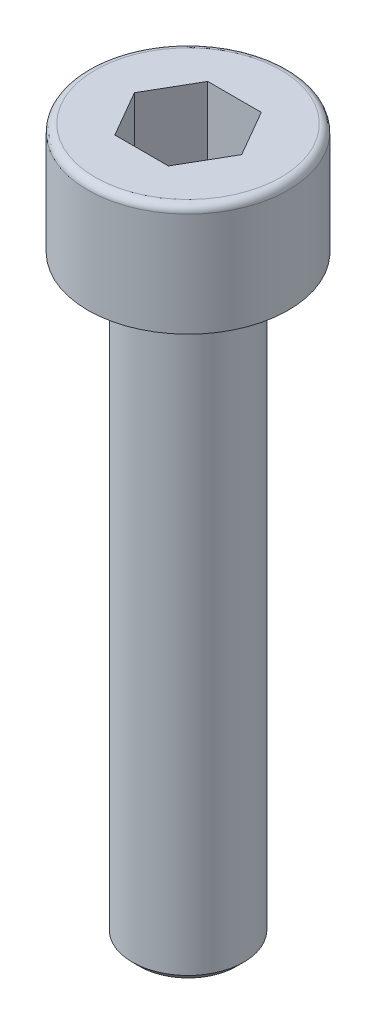
ISO-10303-21;
HEADER;
FILE_DESCRIPTION(('STEP AP214'),'2;1');
FILE_NAME('part.step','',(''),(''),'','','');
FILE_SCHEMA(('AUTOMOTIVE_DESIGN { 1 0 10303 214 1 1 1 1 }'));
ENDSEC;
DATA;
#1=APPLICATION_CONTEXT('core data for automotive mechanical design processes');
#2=APPLICATION_PROTOCOL_DEFINITION('international standard','automotive_design',2000,#1);
#3=PRODUCT_CONTEXT('',#1,'mechanical');
#4=PRODUCT('Part','Part','',(#3));
#5=PRODUCT_RELATED_PRODUCT_CATEGORY('part','',(#4));
#6=PRODUCT_DEFINITION_FORMATION('','',#4);
#7=PRODUCT_DEFINITION_CONTEXT('part definition',#1,'design');
#8=PRODUCT_DEFINITION('design','',#6,#7);
#9=PRODUCT_DEFINITION_SHAPE('','',#8);
#10=(LENGTH_UNIT() NAMED_UNIT(*) SI_UNIT(.MILLI.,.METRE.));
#11=(NAMED_UNIT(*) PLANE_ANGLE_UNIT() SI_UNIT($,.RADIAN.));
#12=(NAMED_UNIT(*) SI_UNIT($,.STERADIAN.) SOLID_ANGLE_UNIT());
#13=UNCERTAINTY_MEASURE_WITH_UNIT(LENGTH_MEASURE(1.E-05),#10,'distance_accuracy_value','');
#14=(GEOMETRIC_REPRESENTATION_CONTEXT(3) GLOBAL_UNCERTAINTY_ASSIGNED_CONTEXT((#13)) GLOBAL_UNIT_ASSIGNED_CONTEXT((#10,
#11,#12)) REPRESENTATION_CONTEXT('',''));
#15=CARTESIAN_POINT('',(0.,0.,0.));
#16=DIRECTION('',(0.,0.,1.));
#17=DIRECTION('',(1.,0.,0.));
#18=AXIS2_PLACEMENT_3D('',#15,#16,#17);
#19=CARTESIAN_POINT('',(0.,3.,-2.5));
#20=DIRECTION('',(0.,-1.,0.));
#21=DIRECTION('',(0.,0.,-1.));
#22=AXIS2_PLACEMENT_3D('',#19,#20,#21);
#23=PLANE('',#22);
#24=DIRECTION('',(-1.,0.,0.));
#25=VECTOR('',#24,1.);
#26=CARTESIAN_POINT('',(0.721687836487032,3.,-1.25));
#27=LINE('',#26,#25);
#28=CARTESIAN_POINT('',(0.721687836487032,3.,-1.25));
#29=VERTEX_POINT('',#28);
#30=CARTESIAN_POINT('',(-0.721687836487032,3.,-1.25));
#31=VERTEX_POINT('',#30);
#32=EDGE_CURVE('E122',#29,#31,#27,.T.);
#33=ORIENTED_EDGE('',*,*,#32,.F.);
#34=DIRECTION('',(-0.5,0.,-0.866025403784439));
#35=VECTOR('',#34,1.);
#36=CARTESIAN_POINT('',(1.44337567297406,3.,0.));
#37=LINE('',#36,#35);
#38=CARTESIAN_POINT('',(1.44337567297406,3.,0.));
#39=VERTEX_POINT('',#38);
#40=EDGE_CURVE('E48',#39,#29,#37,.T.);
#41=ORIENTED_EDGE('',*,*,#40,.F.);
#42=DIRECTION('',(0.5,0.,-0.866025403784438));
#43=VECTOR('',#42,1.);
#44=CARTESIAN_POINT('',(0.721687836487032,3.,1.25));
#45=LINE('',#44,#43);
#46=CARTESIAN_POINT('',(0.721687836487032,3.,1.25));
#47=VERTEX_POINT('',#46);
#48=EDGE_CURVE('E131',#47,#39,#45,.T.);
#49=ORIENTED_EDGE('',*,*,#48,.F.);
#50=DIRECTION('',(1.,0.,0.));
#51=VECTOR('',#50,1.);
#52=CARTESIAN_POINT('',(-0.721687836487032,3.,1.25));
#53=LINE('',#52,#51);
#54=CARTESIAN_POINT('',(-0.721687836487032,3.,1.25));
#55=VERTEX_POINT('',#54);
#56=EDGE_CURVE('E129',#55,#47,#53,.T.);
#57=ORIENTED_EDGE('',*,*,#56,.F.);
#58=DIRECTION('',(0.5,0.,0.866025403784439));
#59=VECTOR('',#58,1.);
#60=CARTESIAN_POINT('',(-1.44337567297406,3.,0.));
#61=LINE('',#60,#59);
#62=CARTESIAN_POINT('',(-1.44337567297406,3.,0.));
#63=VERTEX_POINT('',#62);
#64=EDGE_CURVE('E96',#63,#55,#61,.T.);
#65=ORIENTED_EDGE('',*,*,#64,.F.);
#66=DIRECTION('',(-0.5,0.,0.866025403784439));
#67=VECTOR('',#66,1.);
#68=CARTESIAN_POINT('',(-0.721687836487032,3.,-1.25));
#69=LINE('',#68,#67);
#70=EDGE_CURVE('E125',#31,#63,#69,.T.);
#71=ORIENTED_EDGE('',*,*,#70,.F.);
#72=EDGE_LOOP('',(#33,#41,#49,#57,#65,#71));
#73=FACE_BOUND('',#72,.T.);
#74=CARTESIAN_POINT('',(0.,3.,0.));
#75=DIRECTION('',(0.,1.,0.));
#76=DIRECTION('',(0.,0.,1.));
#77=AXIS2_PLACEMENT_3D('',#74,#75,#76);
#78=CIRCLE('',#77,2.5);
#79=CARTESIAN_POINT('',(0.,3.,2.5));
#80=VERTEX_POINT('',#79);
#81=EDGE_CURVE('E11',#80,#80,#78,.T.);
#82=ORIENTED_EDGE('',*,*,#81,.T.);
#83=EDGE_LOOP('',(#82));
#84=FACE_BOUND('',#83,.T.);
#85=ADVANCED_FACE('F34',(#73,#84),#23,.F.);
#86=CARTESIAN_POINT('',(0.,2.8,0.));
#87=DIRECTION('',(0.,1.,0.));
#88=DIRECTION('',(0.,0.,1.));
#89=AXIS2_PLACEMENT_3D('',#86,#87,#88);
#90=TOROIDAL_SURFACE('',#89,2.5,0.2);
#91=ORIENTED_EDGE('',*,*,#81,.F.);
#92=EDGE_LOOP('',(#91));
#93=FACE_BOUND('',#92,.T.);
#94=CARTESIAN_POINT('',(0.,2.8,0.));
#95=DIRECTION('',(0.,1.,0.));
#96=DIRECTION('',(0.,0.,1.));
#97=AXIS2_PLACEMENT_3D('',#94,#95,#96);
#98=CIRCLE('',#97,2.7);
#99=CARTESIAN_POINT('',(0.,2.8,2.7));
#100=VERTEX_POINT('',#99);
#101=EDGE_CURVE('E41',#100,#100,#98,.T.);
#102=ORIENTED_EDGE('',*,*,#101,.T.);
#103=EDGE_LOOP('',(#102));
#104=FACE_BOUND('',#103,.T.);
#105=ADVANCED_FACE('F157',(#93,#104),#90,.T.);
#106=CARTESIAN_POINT('',(0.,11.8274509803922,0.));
#107=DIRECTION('',(0.,1.,0.));
#108=DIRECTION('',(0.,0.,1.));
#109=AXIS2_PLACEMENT_3D('',#106,#107,#108);
#110=CYLINDRICAL_SURFACE('',#109,2.7);
#111=ORIENTED_EDGE('',*,*,#101,.F.);
#112=EDGE_LOOP('',(#111));
#113=FACE_BOUND('',#112,.T.);
#114=CARTESIAN_POINT('',(0.,0.,0.));
#115=DIRECTION('',(0.,1.,0.));
#116=DIRECTION('',(0.,0.,1.));
#117=AXIS2_PLACEMENT_3D('',#114,#115,#116);
#118=CIRCLE('',#117,2.7);
#119=CARTESIAN_POINT('',(0.,0.,2.7));
#120=VERTEX_POINT('',#119);
#121=EDGE_CURVE('E152',#120,#120,#118,.T.);
#122=ORIENTED_EDGE('',*,*,#121,.T.);
#123=EDGE_LOOP('',(#122));
#124=FACE_BOUND('',#123,.T.);
#125=ADVANCED_FACE('F159',(#113,#124),#110,.T.);
#126=CARTESIAN_POINT('',(0.,0.,-1.7));
#127=DIRECTION('',(0.,1.,0.));
#128=DIRECTION('',(0.,0.,1.));
#129=AXIS2_PLACEMENT_3D('',#126,#127,#128);
#130=PLANE('',#129);
#131=ORIENTED_EDGE('',*,*,#121,.F.);
#132=EDGE_LOOP('',(#131));
#133=FACE_BOUND('',#132,.T.);
#134=CARTESIAN_POINT('',(0.,0.,0.));
#135=DIRECTION('',(0.,1.,0.));
#136=DIRECTION('',(0.,0.,1.));
#137=AXIS2_PLACEMENT_3D('',#134,#135,#136);
#138=CIRCLE('',#137,1.7);
#139=CARTESIAN_POINT('',(0.,0.,1.7));
#140=VERTEX_POINT('',#139);
#141=EDGE_CURVE('E149',#140,#140,#138,.T.);
#142=ORIENTED_EDGE('',*,*,#141,.T.);
#143=EDGE_LOOP('',(#142));
#144=FACE_BOUND('',#143,.T.);
#145=ADVANCED_FACE('F162',(#133,#144),#130,.F.);
#146=CARTESIAN_POINT('',(0.,-0.2,0.));
#147=DIRECTION('',(0.,1.,0.));
#148=DIRECTION('',(0.,0.,1.));
#149=AXIS2_PLACEMENT_3D('',#146,#147,#148);
#150=TOROIDAL_SURFACE('',#149,1.7,0.2);
#151=ORIENTED_EDGE('',*,*,#141,.F.);
#152=EDGE_LOOP('',(#151));
#153=FACE_BOUND('',#152,.T.);
#154=CARTESIAN_POINT('',(0.,-0.199999999999999,0.));
#155=DIRECTION('',(0.,1.,0.));
#156=DIRECTION('',(0.,0.,1.));
#157=AXIS2_PLACEMENT_3D('',#154,#155,#156);
#158=CIRCLE('',#157,1.5);
#159=CARTESIAN_POINT('',(0.,-0.199999999999999,1.5));
#160=VERTEX_POINT('',#159);
#161=EDGE_CURVE('E146',#160,#160,#158,.T.);
#162=ORIENTED_EDGE('',*,*,#161,.T.);
#163=EDGE_LOOP('',(#162));
#164=FACE_BOUND('',#163,.T.);
#165=ADVANCED_FACE('F168',(#153,#164),#150,.F.);
#166=CARTESIAN_POINT('',(0.,11.8274509803922,0.));
#167=DIRECTION('',(0.,1.,0.));
#168=DIRECTION('',(0.,0.,1.));
#169=AXIS2_PLACEMENT_3D('',#166,#167,#168);
#170=CYLINDRICAL_SURFACE('',#169,1.5);
#171=ORIENTED_EDGE('',*,*,#161,.F.);
#172=EDGE_LOOP('',(#171));
#173=FACE_BOUND('',#172,.T.);
#174=CARTESIAN_POINT('',(0.,-15.8,0.));
#175=DIRECTION('',(0.,1.,0.));
#176=DIRECTION('',(0.,0.,1.));
#177=AXIS2_PLACEMENT_3D('',#174,#175,#176);
#178=CIRCLE('',#177,1.5);
#179=CARTESIAN_POINT('',(0.,-15.8,1.5));
#180=VERTEX_POINT('',#179);
#181=EDGE_CURVE('E143',#180,#180,#178,.T.);
#182=ORIENTED_EDGE('',*,*,#181,.T.);
#183=EDGE_LOOP('',(#182));
#184=FACE_BOUND('',#183,.T.);
#185=ADVANCED_FACE('F174',(#173,#184),#170,.T.);
#186=CARTESIAN_POINT('',(0.,-16.,0.));
#187=DIRECTION('',(0.,1.,0.));
#188=DIRECTION('',(0.,0.,1.));
#189=AXIS2_PLACEMENT_3D('',#186,#187,#188);
#190=CONICAL_SURFACE('',#189,1.3,0.785398163397447);
#191=ORIENTED_EDGE('',*,*,#181,.F.);
#192=EDGE_LOOP('',(#191));
#193=FACE_BOUND('',#192,.T.);
#194=CARTESIAN_POINT('',(0.,-16.,0.));
#195=DIRECTION('',(0.,1.,0.));
#196=DIRECTION('',(0.,0.,1.));
#197=AXIS2_PLACEMENT_3D('',#194,#195,#196);
#198=CIRCLE('',#197,1.3);
#199=CARTESIAN_POINT('',(0.,-16.,1.3));
#200=VERTEX_POINT('',#199);
#201=EDGE_CURVE('E135',#200,#200,#198,.T.);
#202=ORIENTED_EDGE('',*,*,#201,.T.);
#203=EDGE_LOOP('',(#202));
#204=FACE_BOUND('',#203,.T.);
#205=ADVANCED_FACE('F180',(#193,#204),#190,.T.);
#206=CARTESIAN_POINT('',(0.,-16.,0.));
#207=DIRECTION('',(0.,1.,0.));
#208=DIRECTION('',(0.,0.,1.));
#209=AXIS2_PLACEMENT_3D('',#206,#207,#208);
#210=PLANE('',#209);
#211=ORIENTED_EDGE('',*,*,#201,.F.);
#212=EDGE_LOOP('',(#211));
#213=FACE_BOUND('',#212,.T.);
#214=ADVANCED_FACE('F186',(#213),#210,.F.);
#215=CARTESIAN_POINT('',(1.44337567297406,1.,0.));
#216=DIRECTION('',(0.866025403784439,0.,-0.5));
#217=DIRECTION('',(-0.5,0.,-0.866025403784439));
#218=AXIS2_PLACEMENT_3D('',#215,#216,#217);
#219=PLANE('',#218);
#220=ORIENTED_EDGE('',*,*,#40,.T.);
#221=DIRECTION('',(0.,1.,0.));
#222=VECTOR('',#221,1.);
#223=CARTESIAN_POINT('',(0.721687836487032,1.,-1.25));
#224=LINE('',#223,#222);
#225=CARTESIAN_POINT('',(0.721687836487032,1.,-1.25));
#226=VERTEX_POINT('',#225);
#227=EDGE_CURVE('E78',#226,#29,#224,.T.);
#228=ORIENTED_EDGE('',*,*,#227,.F.);
#229=DIRECTION('',(-0.5,0.,-0.866025403784439));
#230=VECTOR('',#229,1.);
#231=CARTESIAN_POINT('',(1.44337567297406,1.,0.));
#232=LINE('',#231,#230);
#233=CARTESIAN_POINT('',(1.44337567297406,1.,0.));
#234=VERTEX_POINT('',#233);
#235=EDGE_CURVE('E133',#234,#226,#232,.T.);
#236=ORIENTED_EDGE('',*,*,#235,.F.);
#237=DIRECTION('',(0.,1.,0.));
#238=VECTOR('',#237,1.);
#239=CARTESIAN_POINT('',(1.44337567297406,1.,0.));
#240=LINE('',#239,#238);
#241=EDGE_CURVE('E56',#234,#39,#240,.T.);
#242=ORIENTED_EDGE('',*,*,#241,.T.);
#243=EDGE_LOOP('',(#220,#228,#236,#242));
#244=FACE_BOUND('',#243,.T.);
#245=ADVANCED_FACE('F191',(#244),#219,.F.);
#246=CARTESIAN_POINT('',(0.721687836487032,1.,1.25));
#247=DIRECTION('',(0.866025403784438,0.,0.5));
#248=DIRECTION('',(0.5,0.,-0.866025403784439));
#249=AXIS2_PLACEMENT_3D('',#246,#247,#248);
#250=PLANE('',#249);
#251=ORIENTED_EDGE('',*,*,#48,.T.);
#252=ORIENTED_EDGE('',*,*,#241,.F.);
#253=DIRECTION('',(0.5,0.,-0.866025403784438));
#254=VECTOR('',#253,1.);
#255=CARTESIAN_POINT('',(0.721687836487032,1.,1.25));
#256=LINE('',#255,#254);
#257=CARTESIAN_POINT('',(0.721687836487032,1.,1.25));
#258=VERTEX_POINT('',#257);
#259=EDGE_CURVE('E108',#258,#234,#256,.T.);
#260=ORIENTED_EDGE('',*,*,#259,.F.);
#261=DIRECTION('',(0.,1.,0.));
#262=VECTOR('',#261,1.);
#263=CARTESIAN_POINT('',(0.721687836487032,1.,1.25));
#264=LINE('',#263,#262);
#265=EDGE_CURVE('E100',#258,#47,#264,.T.);
#266=ORIENTED_EDGE('',*,*,#265,.T.);
#267=EDGE_LOOP('',(#251,#252,#260,#266));
#268=FACE_BOUND('',#267,.T.);
#269=ADVANCED_FACE('F196',(#268),#250,.F.);
#270=CARTESIAN_POINT('',(-0.721687836487032,1.,1.25));
#271=DIRECTION('',(0.,0.,1.));
#272=DIRECTION('',(1.,0.,0.));
#273=AXIS2_PLACEMENT_3D('',#270,#271,#272);
#274=PLANE('',#273);
#275=ORIENTED_EDGE('',*,*,#56,.T.);
#276=ORIENTED_EDGE('',*,*,#265,.F.);
#277=DIRECTION('',(1.,0.,0.));
#278=VECTOR('',#277,1.);
#279=CARTESIAN_POINT('',(-0.721687836487032,1.,1.25));
#280=LINE('',#279,#278);
#281=CARTESIAN_POINT('',(-0.721687836487032,1.,1.25));
#282=VERTEX_POINT('',#281);
#283=EDGE_CURVE('E104',#282,#258,#280,.T.);
#284=ORIENTED_EDGE('',*,*,#283,.F.);
#285=DIRECTION('',(0.,1.,0.));
#286=VECTOR('',#285,1.);
#287=CARTESIAN_POINT('',(-0.721687836487032,1.,1.25));
#288=LINE('',#287,#286);
#289=EDGE_CURVE('E89',#282,#55,#288,.T.);
#290=ORIENTED_EDGE('',*,*,#289,.T.);
#291=EDGE_LOOP('',(#275,#276,#284,#290));
#292=FACE_BOUND('',#291,.T.);
#293=ADVANCED_FACE('F105',(#292),#274,.F.);
#294=CARTESIAN_POINT('',(-1.44337567297406,1.,0.));
#295=DIRECTION('',(-0.866025403784439,0.,0.5));
#296=DIRECTION('',(0.5,0.,0.866025403784439));
#297=AXIS2_PLACEMENT_3D('',#294,#295,#296);
#298=PLANE('',#297);
#299=ORIENTED_EDGE('',*,*,#64,.T.);
#300=ORIENTED_EDGE('',*,*,#289,.F.);
#301=DIRECTION('',(0.5,0.,0.866025403784439));
#302=VECTOR('',#301,1.);
#303=CARTESIAN_POINT('',(-1.44337567297406,1.,0.));
#304=LINE('',#303,#302);
#305=CARTESIAN_POINT('',(-1.44337567297406,1.,0.));
#306=VERTEX_POINT('',#305);
#307=EDGE_CURVE('E93',#306,#282,#304,.T.);
#308=ORIENTED_EDGE('',*,*,#307,.F.);
#309=DIRECTION('',(0.,1.,0.));
#310=VECTOR('',#309,1.);
#311=CARTESIAN_POINT('',(-1.44337567297406,1.,0.));
#312=LINE('',#311,#310);
#313=EDGE_CURVE('E101',#306,#63,#312,.T.);
#314=ORIENTED_EDGE('',*,*,#313,.T.);
#315=EDGE_LOOP('',(#299,#300,#308,#314));
#316=FACE_BOUND('',#315,.T.);
#317=ADVANCED_FACE('F91',(#316),#298,.F.);
#318=CARTESIAN_POINT('',(-0.721687836487032,1.,-1.25));
#319=DIRECTION('',(-0.866025403784439,0.,-0.5));
#320=DIRECTION('',(-0.5,0.,0.866025403784439));
#321=AXIS2_PLACEMENT_3D('',#318,#319,#320);
#322=PLANE('',#321);
#323=ORIENTED_EDGE('',*,*,#70,.T.);
#324=ORIENTED_EDGE('',*,*,#313,.F.);
#325=DIRECTION('',(-0.5,0.,0.866025403784439));
#326=VECTOR('',#325,1.);
#327=CARTESIAN_POINT('',(-0.721687836487032,1.,-1.25));
#328=LINE('',#327,#326);
#329=CARTESIAN_POINT('',(-0.721687836487032,1.,-1.25));
#330=VERTEX_POINT('',#329);
#331=EDGE_CURVE('E114',#330,#306,#328,.T.);
#332=ORIENTED_EDGE('',*,*,#331,.F.);
#333=DIRECTION('',(0.,1.,0.));
#334=VECTOR('',#333,1.);
#335=CARTESIAN_POINT('',(-0.721687836487032,1.,-1.25));
#336=LINE('',#335,#334);
#337=EDGE_CURVE('E138',#330,#31,#336,.T.);
#338=ORIENTED_EDGE('',*,*,#337,.T.);
#339=EDGE_LOOP('',(#323,#324,#332,#338));
#340=FACE_BOUND('',#339,.T.);
#341=ADVANCED_FACE('F222',(#340),#322,.F.);
#342=CARTESIAN_POINT('',(0.721687836487032,1.,-1.25));
#343=DIRECTION('',(0.,0.,-1.));
#344=DIRECTION('',(-1.,0.,0.));
#345=AXIS2_PLACEMENT_3D('',#342,#343,#344);
#346=PLANE('',#345);
#347=ORIENTED_EDGE('',*,*,#32,.T.);
#348=ORIENTED_EDGE('',*,*,#337,.F.);
#349=DIRECTION('',(-1.,0.,0.));
#350=VECTOR('',#349,1.);
#351=CARTESIAN_POINT('',(0.721687836487032,1.,-1.25));
#352=LINE('',#351,#350);
#353=EDGE_CURVE('E116',#226,#330,#352,.T.);
#354=ORIENTED_EDGE('',*,*,#353,.F.);
#355=ORIENTED_EDGE('',*,*,#227,.T.);
#356=EDGE_LOOP('',(#347,#348,#354,#355));
#357=FACE_BOUND('',#356,.T.);
#358=ADVANCED_FACE('F210',(#357),#346,.F.);
#359=CARTESIAN_POINT('',(0.,1.,0.));
#360=DIRECTION('',(0.,1.,0.));
#361=DIRECTION('',(0.,0.,1.));
#362=AXIS2_PLACEMENT_3D('',#359,#360,#361);
#363=PLANE('',#362);
#364=ORIENTED_EDGE('',*,*,#235,.T.);
#365=ORIENTED_EDGE('',*,*,#353,.T.);
#366=ORIENTED_EDGE('',*,*,#331,.T.);
#367=ORIENTED_EDGE('',*,*,#307,.T.);
#368=ORIENTED_EDGE('',*,*,#283,.T.);
#369=ORIENTED_EDGE('',*,*,#259,.T.);
#370=EDGE_LOOP('',(#364,#365,#366,#367,#368,#369));
#371=FACE_BOUND('',#370,.T.);
#372=ADVANCED_FACE('F111',(#371),#363,.T.);
#373=CLOSED_SHELL('',(#85,#105,#125,#145,#165,#185,#205,#214,#245,#269,#293,#317,#341,#358,#372));
#374=MANIFOLD_SOLID_BREP('B2',#373);
#375=ADVANCED_BREP_SHAPE_REPRESENTATION('',(#18,#374),#14);
#376=SHAPE_DEFINITION_REPRESENTATION(#9,#375);
ENDSEC;
END-ISO-10303-21;
